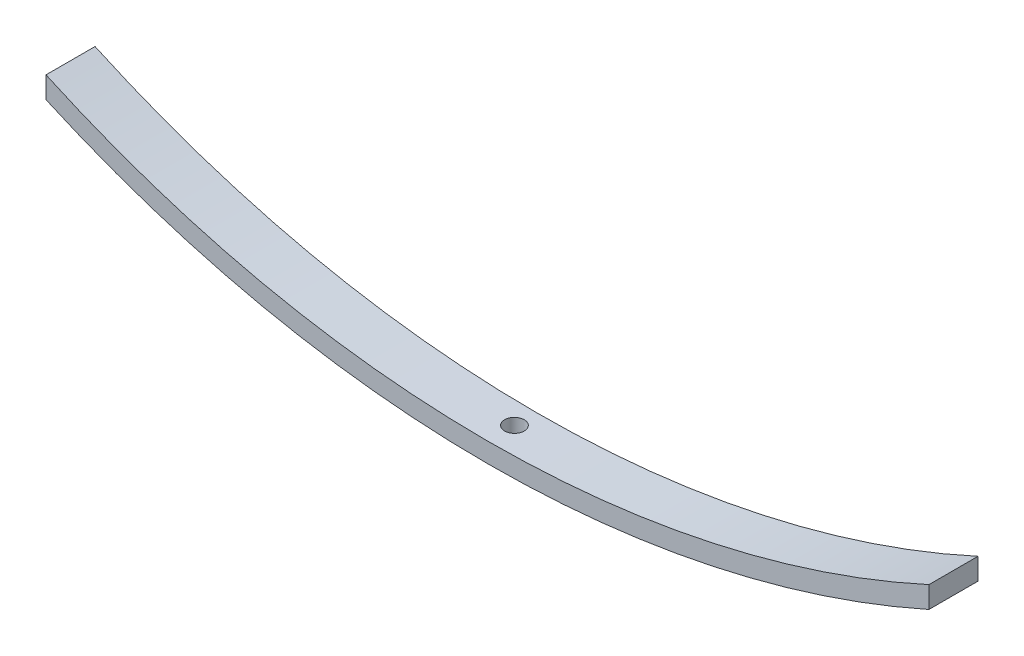
ISO-10303-21;
HEADER;
FILE_DESCRIPTION(('STEP AP214'),'2;1');
FILE_NAME('part.step','',(''),(''),'','','');
FILE_SCHEMA(('AUTOMOTIVE_DESIGN { 1 0 10303 214 1 1 1 1 }'));
ENDSEC;
DATA;
#1=APPLICATION_CONTEXT('core data for automotive mechanical design processes');
#2=APPLICATION_PROTOCOL_DEFINITION('international standard','automotive_design',2000,#1);
#3=PRODUCT_CONTEXT('',#1,'mechanical');
#4=PRODUCT('Part','Part','',(#3));
#5=PRODUCT_RELATED_PRODUCT_CATEGORY('part','',(#4));
#6=PRODUCT_DEFINITION_FORMATION('','',#4);
#7=PRODUCT_DEFINITION_CONTEXT('part definition',#1,'design');
#8=PRODUCT_DEFINITION('design','',#6,#7);
#9=PRODUCT_DEFINITION_SHAPE('','',#8);
#10=(LENGTH_UNIT() NAMED_UNIT(*) SI_UNIT(.MILLI.,.METRE.));
#11=(NAMED_UNIT(*) PLANE_ANGLE_UNIT() SI_UNIT($,.RADIAN.));
#12=(NAMED_UNIT(*) SI_UNIT($,.STERADIAN.) SOLID_ANGLE_UNIT());
#13=UNCERTAINTY_MEASURE_WITH_UNIT(LENGTH_MEASURE(1.E-05),#10,'distance_accuracy_value','');
#14=(GEOMETRIC_REPRESENTATION_CONTEXT(3) GLOBAL_UNCERTAINTY_ASSIGNED_CONTEXT((#13)) GLOBAL_UNIT_ASSIGNED_CONTEXT((#10,
#11,#12)) REPRESENTATION_CONTEXT('',''));
#15=CARTESIAN_POINT('',(0.,0.,0.));
#16=DIRECTION('',(0.,0.,1.));
#17=DIRECTION('',(1.,0.,0.));
#18=AXIS2_PLACEMENT_3D('',#15,#16,#17);
#19=CARTESIAN_POINT('',(-450.,-1003.74299499424,50.));
#20=DIRECTION('',(-1.,0.,0.));
#21=DIRECTION('',(0.,-1.,0.));
#22=AXIS2_PLACEMENT_3D('',#19,#20,#21);
#23=PLANE('',#22);
#24=DIRECTION('',(0.,1.,0.));
#25=VECTOR('',#24,1.);
#26=CARTESIAN_POINT('',(-450.,-1003.74299499424,0.));
#27=LINE('',#26,#25);
#28=CARTESIAN_POINT('',(-450.,-1003.74299499424,0.));
#29=VERTEX_POINT('',#28);
#30=CARTESIAN_POINT('',(-450.,-981.784090317214,0.));
#31=VERTEX_POINT('',#30);
#32=EDGE_CURVE('E117',#29,#31,#27,.T.);
#33=ORIENTED_EDGE('',*,*,#32,.F.);
#34=DIRECTION('',(0.,0.,-1.));
#35=VECTOR('',#34,1.);
#36=CARTESIAN_POINT('',(-450.,-1003.74299499424,50.));
#37=LINE('',#36,#35);
#38=CARTESIAN_POINT('',(-450.,-1003.74299499424,50.));
#39=VERTEX_POINT('',#38);
#40=EDGE_CURVE('E11',#39,#29,#37,.T.);
#41=ORIENTED_EDGE('',*,*,#40,.F.);
#42=DIRECTION('',(0.,1.,0.));
#43=VECTOR('',#42,1.);
#44=CARTESIAN_POINT('',(-450.,-1003.74299499424,50.));
#45=LINE('',#44,#43);
#46=CARTESIAN_POINT('',(-450.,-981.784090317214,50.));
#47=VERTEX_POINT('',#46);
#48=EDGE_CURVE('E109',#39,#47,#45,.T.);
#49=ORIENTED_EDGE('',*,*,#48,.T.);
#50=DIRECTION('',(0.,0.,-1.));
#51=VECTOR('',#50,1.);
#52=CARTESIAN_POINT('',(-450.,-981.784090317214,50.));
#53=LINE('',#52,#51);
#54=EDGE_CURVE('E85',#47,#31,#53,.T.);
#55=ORIENTED_EDGE('',*,*,#54,.T.);
#56=EDGE_LOOP('',(#33,#41,#49,#55));
#57=FACE_BOUND('',#56,.T.);
#58=ADVANCED_FACE('F39',(#57),#23,.T.);
#59=CARTESIAN_POINT('',(0.,0.,50.));
#60=DIRECTION('',(0.,0.,-1.));
#61=DIRECTION('',(-1.,0.,0.));
#62=AXIS2_PLACEMENT_3D('',#59,#60,#61);
#63=CYLINDRICAL_SURFACE('',#62,1100.);
#64=CARTESIAN_POINT('',(0.,-1100.,32.5));
#65=CARTESIAN_POINT('',(0.280947064307973,-1100.00000005117,32.5000020216511));
#66=CARTESIAN_POINT('',(0.561860972590403,-1099.99989213973,32.4881554478381));
#67=CARTESIAN_POINT('',(1.12178578051435,-1099.99946361781,32.4408518933722));
#68=CARTESIAN_POINT('',(1.40079616039585,-1099.99914295142,32.405388705864));
#69=CARTESIAN_POINT('',(1.95513034684573,-1099.99829744652,32.3110449823883));
#70=CARTESIAN_POINT('',(2.23044990980033,-1099.99777239089,32.2521395419737));
#71=CARTESIAN_POINT('',(2.7751497667588,-1099.99653304989,32.1113304951339));
#72=CARTESIAN_POINT('',(3.04452995547942,-1099.99581876118,32.0294264813815));
#73=CARTESIAN_POINT('',(3.57529527460837,-1099.99422165126,31.8432499038494));
#74=CARTESIAN_POINT('',(3.83668430405865,-1099.99333891383,31.738988454337));
#75=CARTESIAN_POINT('',(4.34975280879096,-1099.99142972603,31.5088127117588));
#76=CARTESIAN_POINT('',(4.60143213081407,-1099.9904032734,31.3828980770881));
#77=CARTESIAN_POINT('',(5.0932266343026,-1099.9882360755,31.1103460883793));
#78=CARTESIAN_POINT('',(5.33334464279631,-1099.9870953584,30.9637138351722));
#79=CARTESIAN_POINT('',(5.80037129075108,-1099.98473181792,30.6507488257479));
#80=CARTESIAN_POINT('',(6.02728021159513,-1099.9835089963,30.4844164894155));
#81=CARTESIAN_POINT('',(6.46631265262179,-1099.9810157489,30.1332061640088));
#82=CARTESIAN_POINT('',(6.67843408632362,-1099.97974531645,29.9483255667576));
#83=CARTESIAN_POINT('',(7.08634881654811,-1099.97719306931,29.5613522944773));
#84=CARTESIAN_POINT('',(7.2821420962676,-1099.97591125461,29.359259601736));
#85=CARTESIAN_POINT('',(7.65601579250191,-1099.97337257883,28.9392906534728));
#86=CARTESIAN_POINT('',(7.83409551840596,-1099.97211571873,28.7214137831341));
#87=CARTESIAN_POINT('',(8.17126738505734,-1099.96966268322,28.2714323481411));
#88=CARTESIAN_POINT('',(8.33035952943423,-1099.9684665078,28.0393277862065));
#89=CARTESIAN_POINT('',(8.6284250166648,-1099.96616879997,27.5625412338764));
#90=CARTESIAN_POINT('',(8.76739838401762,-1099.96506726744,27.3178592587974));
#91=CARTESIAN_POINT('',(9.02423845245466,-1099.96299011505,26.8176570746719));
#92=CARTESIAN_POINT('',(9.14210515282945,-1099.96201449518,26.5621368652612));
#93=CARTESIAN_POINT('',(9.35589356320991,-1099.96021686752,26.0420753556994));
#94=CARTESIAN_POINT('',(9.45181532069158,-1099.9593948594,25.7775340750661));
#95=CARTESIAN_POINT('',(9.6210320783027,-1099.95792778982,25.2413106724479));
#96=CARTESIAN_POINT('',(9.69432707912008,-1099.95728272837,24.9696285506802));
#97=CARTESIAN_POINT('',(9.81776748787596,-1099.95618788033,24.4210622387808));
#98=CARTESIAN_POINT('',(9.86791350030773,-1099.95573808865,24.1441781846845));
#99=CARTESIAN_POINT('',(9.94470215047097,-1099.95504652537,23.5871696647333));
#100=CARTESIAN_POINT('',(9.97134478860151,-1099.95480475378,23.3070451989335));
#101=CARTESIAN_POINT('',(10.0009371907584,-1099.95453609485,22.7455480448875));
#102=CARTESIAN_POINT('',(10.003887001745,-1099.95450920708,22.4641753591165));
#103=CARTESIAN_POINT('',(9.98607289476243,-1099.95467107818,21.9021817319619));
#104=CARTESIAN_POINT('',(9.965308977192,-1099.95485983704,21.6215607905655));
#105=CARTESIAN_POINT('',(9.90021603221038,-1099.95544763372,21.063073989674));
#106=CARTESIAN_POINT('',(9.85588769419265,-1099.95584666539,20.7852080498216));
#107=CARTESIAN_POINT('',(9.74398155305454,-1099.95684367609,20.2341983398215));
#108=CARTESIAN_POINT('',(9.67640375043628,-1099.95744165513,19.9610545695718));
#109=CARTESIAN_POINT('',(9.51847911119723,-1099.95881958582,19.421430683837));
#110=CARTESIAN_POINT('',(9.42813224886001,-1099.95959953768,19.1549505758786));
#111=CARTESIAN_POINT('',(9.22531191308742,-1099.96131927302,18.6305486862249));
#112=CARTESIAN_POINT('',(9.11283843914294,-1099.9622590565,18.3726269047267));
#113=CARTESIAN_POINT('',(8.86656272873204,-1099.96427179258,17.8671714055499));
#114=CARTESIAN_POINT('',(8.73276017902452,-1099.96534474714,17.6196378405013));
#115=CARTESIAN_POINT('',(8.44477876718316,-1099.96759335706,17.1367223888157));
#116=CARTESIAN_POINT('',(8.29059990492967,-1099.96876901242,16.9013405022501));
#117=CARTESIAN_POINT('',(7.96296196272636,-1099.97118965167,16.4444016228667));
#118=CARTESIAN_POINT('',(7.78950288654837,-1099.97243463555,16.2228446273443));
#119=CARTESIAN_POINT('',(7.42453755271911,-1099.97495859309,15.7951303567988));
#120=CARTESIAN_POINT('',(7.23303129461007,-1099.97623756676,15.5889730821661));
#121=CARTESIAN_POINT('',(6.83332562771209,-1099.97879324704,15.1935164840785));
#122=CARTESIAN_POINT('',(6.62512561226872,-1099.98006995357,15.0042177737951));
#123=CARTESIAN_POINT('',(6.19351853340997,-1099.98258481179,14.6438324390783));
#124=CARTESIAN_POINT('',(5.97011146959816,-1099.98382296348,14.4727458151196));
#125=CARTESIAN_POINT('',(5.50967840926728,-1099.98622556548,14.1500009250355));
#126=CARTESIAN_POINT('',(5.27265241071586,-1099.98739001578,13.9983426618094));
#127=CARTESIAN_POINT('',(4.7866664993514,-1099.98961216017,13.7155327561576));
#128=CARTESIAN_POINT('',(4.5377065866729,-1099.99066985426,13.5843811135007));
#129=CARTESIAN_POINT('',(4.02962249751724,-1099.99264846258,13.3435168404398));
#130=CARTESIAN_POINT('',(3.77049831242723,-1099.99356937668,13.2338042282029));
#131=CARTESIAN_POINT('',(3.24392807012183,-1099.99524828184,13.0365982714823));
#132=CARTESIAN_POINT('',(2.9764820128677,-1099.99600627289,12.9491049271019));
#133=CARTESIAN_POINT('',(2.43516952517331,-1099.99733781424,12.7969596925449));
#134=CARTESIAN_POINT('',(2.16130309631317,-1099.9979113646,12.7323077967468));
#135=CARTESIAN_POINT('',(1.60909695182085,-1099.99885774291,12.6263051983335));
#136=CARTESIAN_POINT('',(1.33075723632501,-1099.99923057088,12.5849544950081));
#137=CARTESIAN_POINT('',(0.771593545451839,-1099.99976491098,12.5258494128803));
#138=CARTESIAN_POINT('',(0.490769659433458,-1099.99992643068,12.5080941887633));
#139=CARTESIAN_POINT('',(-0.0713756577629724,-1100.00003359402,12.4963035779614));
#140=CARTESIAN_POINT('',(-0.352697088929224,-1099.99997923768,12.5022681907142));
#141=CARTESIAN_POINT('',(-0.913837378686011,-1099.99965619194,12.5378748347896));
#142=CARTESIAN_POINT('',(-1.19365623736931,-1099.99938750255,12.5675168646504));
#143=CARTESIAN_POINT('',(-1.74980200235998,-1099.99864341784,12.6502675468223));
#144=CARTESIAN_POINT('',(-2.02612890867426,-1099.99816802251,12.7033761990869));
#145=CARTESIAN_POINT('',(-2.57332170066523,-1099.99702402999,12.832681392134));
#146=CARTESIAN_POINT('',(-2.84418767679329,-1099.996355436,12.9088775501743));
#147=CARTESIAN_POINT('',(-3.37853774997116,-1099.994844021,13.083816268699));
#148=CARTESIAN_POINT('',(-3.64202184713313,-1099.99400119998,13.1825588288409));
#149=CARTESIAN_POINT('',(-4.15973514308947,-1099.99216525379,13.4018882914459));
#150=CARTESIAN_POINT('',(-4.4139643416674,-1099.99117212861,13.52247519442));
#151=CARTESIAN_POINT('',(-4.91136066858346,-1099.98906376295,13.7846360235526));
#152=CARTESIAN_POINT('',(-5.15452779659761,-1099.98794852246,13.9262099503258));
#153=CARTESIAN_POINT('',(-5.62807822212533,-1099.98562754781,14.2293426724206));
#154=CARTESIAN_POINT('',(-5.85846115650697,-1099.98442181108,14.3909020350031));
#155=CARTESIAN_POINT('',(-6.3047980722711,-1099.98195409673,14.7328539213465));
#156=CARTESIAN_POINT('',(-6.52075205340541,-1099.98069211911,14.9132464454312));
#157=CARTESIAN_POINT('',(-6.93669609007042,-1099.97814774351,15.2915824009235));
#158=CARTESIAN_POINT('',(-7.1366861363515,-1099.97686534553,15.4895258425001));
#159=CARTESIAN_POINT('',(-7.5192805340355,-1099.97431653123,15.9015564578257));
#160=CARTESIAN_POINT('',(-7.70188488516435,-1099.97305011491,16.1156436318292));
#161=CARTESIAN_POINT('',(-8.04841491977836,-1099.97056917538,16.5584464198348));
#162=CARTESIAN_POINT('',(-8.21234005256345,-1099.96935465371,16.7871624648145));
#163=CARTESIAN_POINT('',(-8.52034002029632,-1099.96701202092,17.2575914138369));
#164=CARTESIAN_POINT('',(-8.66441485480448,-1099.96588390981,17.4993043181674));
#165=CARTESIAN_POINT('',(-8.93168971938829,-1099.96374612479,17.9940083611056));
#166=CARTESIAN_POINT('',(-9.0548897731304,-1099.96273645075,18.2469994869264));
#167=CARTESIAN_POINT('',(-9.27953928096262,-1099.96086420252,18.7624616538708));
#168=CARTESIAN_POINT('',(-9.38098873558057,-1099.96000162833,19.0249326947644));
#169=CARTESIAN_POINT('',(-9.56141420827453,-1099.95844808083,19.5574843714006));
#170=CARTESIAN_POINT('',(-9.6403905882246,-1099.95775710476,19.8275648845344));
#171=CARTESIAN_POINT('',(-9.77531048728018,-1099.95656635235,20.3734194094439));
#172=CARTESIAN_POINT('',(-9.8312540065221,-1099.95606657601,20.6491934211859));
#173=CARTESIAN_POINT('',(-9.91971041816975,-1099.95527241126,21.2044746995368));
#174=CARTESIAN_POINT('',(-9.95222327318557,-1099.95497802318,21.4839819721024));
#175=CARTESIAN_POINT('',(-9.9935869887929,-1099.95460299441,22.044742053393));
#176=CARTESIAN_POINT('',(-10.0024378499717,-1099.95452235372,22.3259948620747));
#177=CARTESIAN_POINT('',(-9.99641474966445,-1099.95457710805,22.8882356169393));
#178=CARTESIAN_POINT('',(-9.98154168886788,-1099.95471249489,23.1692235727723));
#179=CARTESIAN_POINT('',(-9.92817819983436,-1099.95519544543,23.7289476401099));
#180=CARTESIAN_POINT('',(-9.8896877721794,-1099.95554300913,24.00768375167));
#181=CARTESIAN_POINT('',(-9.78936315775909,-1099.95644044724,24.5609230488737));
#182=CARTESIAN_POINT('',(-9.72752892421368,-1099.95699032205,24.8354262260335));
#183=CARTESIAN_POINT('',(-9.58095639853485,-1099.95827677224,25.378247578608));
#184=CARTESIAN_POINT('',(-9.49621810655042,-1099.95901334763,25.6465657540628));
#185=CARTESIAN_POINT('',(-9.304438217086,-1099.96065230423,26.1751145228585));
#186=CARTESIAN_POINT('',(-9.19739620805113,-1099.96155468852,26.4353449668601));
#187=CARTESIAN_POINT('',(-8.96177089994736,-1099.96349963719,26.9458631765871));
#188=CARTESIAN_POINT('',(-8.8331875967543,-1099.9645422016,27.1961509404087));
#189=CARTESIAN_POINT('',(-8.55539929002957,-1099.96673787208,27.684995049854));
#190=CARTESIAN_POINT('',(-8.40619508437191,-1099.96789097387,27.9235518488939));
#191=CARTESIAN_POINT('',(-8.08822199569385,-1099.97027502198,28.3872485290119));
#192=CARTESIAN_POINT('',(-7.91945313189211,-1099.97150596823,28.6123884232693));
#193=CARTESIAN_POINT('',(-7.56356432748525,-1099.97401066856,29.0476341025049));
#194=CARTESIAN_POINT('',(-7.37644583567259,-1099.97528441926,29.2577410721438));
#195=CARTESIAN_POINT('',(-6.98517229922889,-1099.97783870054,29.6614515965173));
#196=CARTESIAN_POINT('',(-6.78101689079579,-1099.97911923127,29.855054798656));
#197=CARTESIAN_POINT('',(-6.35707164122872,-1099.98165101663,30.2244223053224));
#198=CARTESIAN_POINT('',(-6.13727796443782,-1099.98290226398,30.400182207524));
#199=CARTESIAN_POINT('',(-5.68366731250256,-1099.9853396097,30.7325563312236));
#200=CARTESIAN_POINT('',(-5.44985055868444,-1099.98652570909,30.8891708547745));
#201=CARTESIAN_POINT('',(-4.96972995606513,-1099.98879968479,31.1822187171478));
#202=CARTESIAN_POINT('',(-4.7234197905025,-1099.98988751061,31.3186417076206));
#203=CARTESIAN_POINT('',(-4.22018163412486,-1099.99193332191,31.5702373393554));
#204=CARTESIAN_POINT('',(-3.96325383145126,-1099.99289130968,31.6854103569634));
#205=CARTESIAN_POINT('',(-3.44087746622745,-1099.99464930056,31.8935788467592));
#206=CARTESIAN_POINT('',(-3.17543826339022,-1099.99544947072,31.9865977921384));
#207=CARTESIAN_POINT('',(-2.63775802567634,-1099.99687023153,32.1499313837608));
#208=CARTESIAN_POINT('',(-2.36551879736234,-1099.99749086934,32.2202519925835));
#209=CARTESIAN_POINT('',(-1.7475100578521,-1099.99866540734,32.3523789407716));
#210=CARTESIAN_POINT('',(-1.40033267948958,-1099.99916407617,32.4076898095124));
#211=CARTESIAN_POINT('',(-0.702086281630147,-1099.99983134053,32.4814990757067));
#212=CARTESIAN_POINT('',(-0.351017262236259,-1099.99999993607,32.4999974741347));
#213=CARTESIAN_POINT('',(0.,-1100.,32.5));
#214=B_SPLINE_CURVE_WITH_KNOTS('',3,(#64,#65,#66,#67,#68,#69,#70,#71,#72,#73,#74,#75,#76,#77,
#78,#79,#80,#81,#82,#83,#84,#85,#86,#87,#88,#89,#90,#91,#92,#93,#94,#95,#96,#97,#98,#99,#100,
#101,#102,#103,#104,#105,#106,#107,#108,#109,#110,#111,#112,#113,#114,#115,#116,#117,#118,#119,
#120,#121,#122,#123,#124,#125,#126,#127,#128,#129,#130,#131,#132,#133,#134,#135,#136,#137,#138,
#139,#140,#141,#142,#143,#144,#145,#146,#147,#148,#149,#150,#151,#152,#153,#154,#155,#156,#157,
#158,#159,#160,#161,#162,#163,#164,#165,#166,#167,#168,#169,#170,#171,#172,#173,#174,#175,#176,
#177,#178,#179,#180,#181,#182,#183,#184,#185,#186,#187,#188,#189,#190,#191,#192,#193,#194,#195,
#196,#197,#198,#199,#200,#201,#202,#203,#204,#205,#206,#207,#208,#209,#210,#211,#212,#213),
.UNSPECIFIED.,.T.,.F.,(4,2,2,2,2,2,2,2,2,2,2,2,2,2,2,2,2,2,2,2,2,2,2,2,2,2,2,2,2,2,2,2,2,2,2,2,
2,2,2,2,2,2,2,2,2,2,2,2,2,2,2,2,2,2,2,2,2,2,2,2,2,2,2,2,2,2,2,2,2,2,2,2,2,2,4),(0.,
0.842534577510601,1.68529067514222,2.5289444955584,3.37261325884719,4.21586358809915,
5.0591272218507,5.90218359847124,6.74522200953625,7.58837913164906,8.43153712143766,
9.27472797114516,10.1179186596733,10.9611083214188,11.8042980115051,12.6474858774049,
13.4906737176693,14.3338395383882,15.1770053447907,16.020169479999,16.8633336010304,
17.7064730560677,18.5496124928953,19.3927528820083,20.2358932905217,21.079046082627,
21.9221988796832,22.7653515117916,23.6085041652863,24.4516874730138,25.2948708027221,
26.1380542582581,26.9812377042883,27.8244218648185,28.667606029274,29.5107899862167,
30.3539739174617,31.1971276405931,32.0402813437306,32.8834349948124,33.7265886442239,
34.5697283166834,35.4128679763346,36.2560076557052,37.0991473597693,37.9423110007654,
38.7854746562632,39.6286388002934,40.4718029576155,41.314991966646,42.15818099435,
43.001369066095,43.8445571173779,44.6877315904048,45.5309060584382,46.3740818719793,
47.2172576645916,48.0604014464112,48.9035452074536,49.7466906581313,50.5898361033245,
51.4329971078685,52.2761582738391,53.1192868249362,53.9624145478228,54.8054757551859,
55.6485549696765,56.491841687007,57.3351150982441,58.1788192094785,59.0225083769307,
59.865299602535,60.7078692565258,61.7605379836224,62.813206682851),.UNSPECIFIED.);
#215=CARTESIAN_POINT('',(0.,-1100.,32.5));
#216=VERTEX_POINT('',#215);
#217=EDGE_CURVE('E122',#216,#216,#214,.T.);
#218=ORIENTED_EDGE('',*,*,#217,.T.);
#219=EDGE_LOOP('',(#218));
#220=FACE_BOUND('',#219,.T.);
#221=CARTESIAN_POINT('',(0.,0.,0.));
#222=DIRECTION('',(0.,0.,1.));
#223=DIRECTION('',(1.,0.,0.));
#224=AXIS2_PLACEMENT_3D('',#221,#222,#223);
#225=CIRCLE('',#224,1100.);
#226=CARTESIAN_POINT('',(450.,-1003.74299499424,0.));
#227=VERTEX_POINT('',#226);
#228=EDGE_CURVE('E77',#29,#227,#225,.T.);
#229=ORIENTED_EDGE('',*,*,#228,.T.);
#230=DIRECTION('',(0.,0.,-1.));
#231=VECTOR('',#230,1.);
#232=CARTESIAN_POINT('',(450.,-1003.74299499424,50.));
#233=LINE('',#232,#231);
#234=CARTESIAN_POINT('',(450.,-1003.74299499424,50.));
#235=VERTEX_POINT('',#234);
#236=EDGE_CURVE('E53',#235,#227,#233,.T.);
#237=ORIENTED_EDGE('',*,*,#236,.F.);
#238=CARTESIAN_POINT('',(0.,0.,50.));
#239=DIRECTION('',(0.,0.,1.));
#240=DIRECTION('',(1.,0.,0.));
#241=AXIS2_PLACEMENT_3D('',#238,#239,#240);
#242=CIRCLE('',#241,1100.);
#243=EDGE_CURVE('E95',#39,#235,#242,.T.);
#244=ORIENTED_EDGE('',*,*,#243,.F.);
#245=ORIENTED_EDGE('',*,*,#40,.T.);
#246=EDGE_LOOP('',(#229,#237,#244,#245));
#247=FACE_BOUND('',#246,.T.);
#248=ADVANCED_FACE('F144',(#220,#247),#63,.T.);
#249=CARTESIAN_POINT('',(450.,-1003.74299499424,50.));
#250=DIRECTION('',(-1.,0.,0.));
#251=DIRECTION('',(0.,0.,1.));
#252=AXIS2_PLACEMENT_3D('',#249,#250,#251);
#253=PLANE('',#252);
#254=DIRECTION('',(0.,1.,0.));
#255=VECTOR('',#254,1.);
#256=CARTESIAN_POINT('',(450.,-1003.74299499424,0.));
#257=LINE('',#256,#255);
#258=CARTESIAN_POINT('',(450.,-981.784090317214,0.));
#259=VERTEX_POINT('',#258);
#260=EDGE_CURVE('E103',#227,#259,#257,.T.);
#261=ORIENTED_EDGE('',*,*,#260,.T.);
#262=DIRECTION('',(0.,0.,-1.));
#263=VECTOR('',#262,1.);
#264=CARTESIAN_POINT('',(450.,-981.784090317214,50.));
#265=LINE('',#264,#263);
#266=CARTESIAN_POINT('',(450.,-981.784090317214,50.));
#267=VERTEX_POINT('',#266);
#268=EDGE_CURVE('E100',#267,#259,#265,.T.);
#269=ORIENTED_EDGE('',*,*,#268,.F.);
#270=DIRECTION('',(0.,1.,0.));
#271=VECTOR('',#270,1.);
#272=CARTESIAN_POINT('',(450.,-1003.74299499424,50.));
#273=LINE('',#272,#271);
#274=EDGE_CURVE('E90',#235,#267,#273,.T.);
#275=ORIENTED_EDGE('',*,*,#274,.F.);
#276=ORIENTED_EDGE('',*,*,#236,.T.);
#277=EDGE_LOOP('',(#261,#269,#275,#276));
#278=FACE_BOUND('',#277,.T.);
#279=ADVANCED_FACE('F101',(#278),#253,.F.);
#280=CARTESIAN_POINT('',(0.,0.,50.));
#281=DIRECTION('',(0.,0.,-1.));
#282=DIRECTION('',(-1.,0.,0.));
#283=AXIS2_PLACEMENT_3D('',#280,#281,#282);
#284=CYLINDRICAL_SURFACE('',#283,1080.);
#285=CARTESIAN_POINT('',(0.,-1080.,32.5));
#286=CARTESIAN_POINT('',(0.280946830993139,-1080.00000005212,32.5000020218661));
#287=CARTESIAN_POINT('',(0.561860503197048,-1079.9998901425,32.4881554676291));
#288=CARTESIAN_POINT('',(1.12178483729184,-1079.99945368572,32.440851992922));
#289=CARTESIAN_POINT('',(1.40079497943695,-1079.99912708161,32.4053888657761));
#290=CARTESIAN_POINT('',(1.95512868065271,-1079.99826592066,32.3110453070886));
#291=CARTESIAN_POINT('',(2.23044799622377,-1079.99773114268,32.2521399718246));
#292=CARTESIAN_POINT('',(2.77514735994904,-1079.99646885303,32.1113311821343));
#293=CARTESIAN_POINT('',(3.04452730281656,-1079.99574133795,32.0294273203683));
#294=CARTESIAN_POINT('',(3.57529212522385,-1079.9941146546,31.8432511000017));
#295=CARTESIAN_POINT('',(3.8366809041254,-1079.99321557165,31.7389898565638));
#296=CARTESIAN_POINT('',(4.34974892135516,-1079.9912710316,31.5088145788331));
#297=CARTESIAN_POINT('',(4.60142800642967,-1079.99022557219,31.3829002029474));
#298=CARTESIAN_POINT('',(5.09322206270993,-1079.98801824419,31.1103487817793));
#299=CARTESIAN_POINT('',(5.33333986077639,-1079.98685640427,30.9637168370231));
#300=CARTESIAN_POINT('',(5.80036612162051,-1079.98444909752,30.650752492377));
#301=CARTESIAN_POINT('',(6.02727486576485,-1079.98320363246,30.4844205123477));
#302=CARTESIAN_POINT('',(6.46630720988523,-1079.98066421508,30.1332107715757));
#303=CARTESIAN_POINT('',(6.67842870908606,-1079.97937025591,29.9483303847854));
#304=CARTESIAN_POINT('',(7.08634359206412,-1079.97677074406,29.5613575338946));
#305=CARTESIAN_POINT('',(7.28213695902863,-1079.97546519138,29.3592650520716));
#306=CARTESIAN_POINT('',(7.6560108561917,-1079.97287950121,28.9392965186679));
#307=CARTESIAN_POINT('',(7.83409069574824,-1079.97159936472,28.7214198522413));
#308=CARTESIAN_POINT('',(8.1712628178961,-1079.96910089973,28.2714388104494));
#309=CARTESIAN_POINT('',(8.33035510411368,-1079.96788257121,28.0393344378013));
#310=CARTESIAN_POINT('',(8.62842099958237,-1079.96554230861,27.5625480867652));
#311=CARTESIAN_POINT('',(8.76739462028087,-1079.96442037447,27.3178661155338));
#312=CARTESIAN_POINT('',(9.02423519233012,-1079.96230475039,26.8176638970605));
#313=CARTESIAN_POINT('',(9.14210214295948,-1079.96131106045,26.5621436494481));
#314=CARTESIAN_POINT('',(9.35589104374611,-1079.95948013732,26.0420820221502));
#315=CARTESIAN_POINT('',(9.45181304149456,-1079.95864290379,25.7775406620299));
#316=CARTESIAN_POINT('',(9.62103026305726,-1079.95714866038,25.241317060164));
#317=CARTESIAN_POINT('',(9.69432548758416,-1079.95649165051,24.9696348186434));
#318=CARTESIAN_POINT('',(9.81776625564527,-1079.95537652278,24.4210685195311));
#319=CARTESIAN_POINT('',(9.86791242792046,-1079.95491839952,24.1441846034323));
#320=CARTESIAN_POINT('',(9.94470141817235,-1079.9542140254,23.5871763367607));
#321=CARTESIAN_POINT('',(9.9713442365628,-1079.95396777453,23.307051986245));
#322=CARTESIAN_POINT('',(10.0009370161434,-1079.95369413652,22.7455550452727));
#323=CARTESIAN_POINT('',(10.0038870244512,-1079.95366674896,22.4641824572998));
#324=CARTESIAN_POINT('',(9.9860733277684,-1079.95383161413,21.9021890106005));
#325=CARTESIAN_POINT('',(9.96530962319048,-1079.95402386687,21.6215681518612));
#326=CARTESIAN_POINT('',(9.90021715618329,-1079.95462254524,21.0630818145463));
#327=CARTESIAN_POINT('',(9.85588910924836,-1079.95502896438,20.7852162525714));
#328=CARTESIAN_POINT('',(9.74398361899045,-1079.95604443403,20.2342072770111));
#329=CARTESIAN_POINT('',(9.67640617618953,-1079.95665348453,19.9610638633197));
#330=CARTESIAN_POINT('',(9.5184823256382,-1079.95805692786,19.421440662503));
#331=CARTESIAN_POINT('',(9.42813589210945,-1079.95885132089,19.1549608829225));
#332=CARTESIAN_POINT('',(9.22531648275569,-1079.9606028983,18.6305596141169));
#333=CARTESIAN_POINT('',(9.11284350640294,-1079.96156008268,18.3726381250958));
#334=CARTESIAN_POINT('',(8.86656878874518,-1079.96361008723,17.8671830227862));
#335=CARTESIAN_POINT('',(8.73276672223304,-1079.96470290946,17.6196495679578));
#336=CARTESIAN_POINT('',(8.44478631650534,-1079.96699315679,17.1367342931325));
#337=CARTESIAN_POINT('',(8.2906079771651,-1079.96819058189,16.9013524732098));
#338=CARTESIAN_POINT('',(7.9629711133764,-1079.97065604481,16.4444136717694));
#339=CARTESIAN_POINT('',(7.78951259254884,-1079.97192408261,16.2228566876553));
#340=CARTESIAN_POINT('',(7.42454839422626,-1079.97449477788,15.7951423767921));
#341=CARTESIAN_POINT('',(7.2330427162563,-1079.97579743535,15.5889850504484));
#342=CARTESIAN_POINT('',(6.83333795236948,-1079.9784004436,15.1935280096799));
#343=CARTESIAN_POINT('',(6.62513823720578,-1079.97970079429,15.0042289312597));
#344=CARTESIAN_POINT('',(6.19353172013911,-1079.98226222741,14.6438428339984));
#345=CARTESIAN_POINT('',(5.97012491782503,-1079.98352330983,14.4727558156496));
#346=CARTESIAN_POINT('',(5.50969233445025,-1079.98597040901,14.150010112189));
#347=CARTESIAN_POINT('',(5.27266655134777,-1079.98715642574,13.9983514299899));
#348=CARTESIAN_POINT('',(4.78668101877967,-1079.98941972652,13.7155406661651));
#349=CARTESIAN_POINT('',(4.53772126945362,-1079.99049701057,13.5843885842996));
#350=CARTESIAN_POINT('',(4.02963744185973,-1079.99251226629,13.3435234148167));
#351=CARTESIAN_POINT('',(3.77051335463881,-1079.99345023783,13.233810346084));
#352=CARTESIAN_POINT('',(3.24394324915048,-1079.99516024107,13.0366034717934));
#353=CARTESIAN_POINT('',(2.97649723084286,-1079.99593227276,12.9491096663429));
#354=CARTESIAN_POINT('',(2.43518476578343,-1079.99728848002,12.796963514242));
#355=CARTESIAN_POINT('',(2.16131832065999,-1079.99787265563,12.7323111617987));
#356=CARTESIAN_POINT('',(1.60911209118594,-1079.99883656744,12.6263076619849));
#357=CARTESIAN_POINT('',(1.33077230697676,-1079.99921630364,12.5849565138779));
#358=CARTESIAN_POINT('',(0.771608807900758,-1079.9997605465,12.5258506003383));
#359=CARTESIAN_POINT('',(0.490785185734503,-1079.99992506116,12.5080949579956));
#360=CARTESIAN_POINT('',(-0.0713596417628769,-1080.00003421713,12.4963034703321));
#361=CARTESIAN_POINT('',(-0.35268084708176,-1079.99997885844,12.5022676244279));
#362=CARTESIAN_POINT('',(-0.91382072087917,-1079.99964983916,12.5378733134857));
#363=CARTESIAN_POINT('',(-1.19363938945646,-1079.99937617858,12.5675148468914));
#364=CARTESIAN_POINT('',(-1.74978481047988,-1079.99861832373,12.6502644997231));
#365=CARTESIAN_POINT('',(-2.0261115629332,-1079.99813412945,12.7033726191009));
#366=CARTESIAN_POINT('',(-2.57330391399844,-1079.99696896159,12.8326766701471));
#367=CARTESIAN_POINT('',(-2.84416960645182,-1079.99628799138,12.9088722047261));
#368=CARTESIAN_POINT('',(-3.37851916238579,-1079.99474859754,13.0838096128953));
#369=CARTESIAN_POINT('',(-3.64200302598271,-1079.9938901739,13.1825514861301));
#370=CARTESIAN_POINT('',(-4.15971591512815,-1079.99202023886,13.4018795146803));
#371=CARTESIAN_POINT('',(-4.4139449404069,-1079.99100872744,13.5224656706323));
#372=CARTESIAN_POINT('',(-4.91134099008323,-1079.98886132745,13.7846249497716));
#373=CARTESIAN_POINT('',(-5.15450801414461,-1079.98772543887,13.9261980735967));
#374=CARTESIAN_POINT('',(-5.62805856512507,-1079.98536149022,14.2293293029079));
#375=CARTESIAN_POINT('',(-5.85844171527824,-1079.98413342744,14.3908879969553));
#376=CARTESIAN_POINT('',(-6.30477912256011,-1079.9816200184,14.7328385470357));
#377=CARTESIAN_POINT('',(-6.52073337943143,-1079.98033467214,14.9132304034045));
#378=CARTESIAN_POINT('',(-6.93667803477774,-1079.97774317989,15.2915650346871));
#379=CARTESIAN_POINT('',(-7.13666842389908,-1079.97643703389,15.4895078198843));
#380=CARTESIAN_POINT('',(-7.51926357718869,-1079.97384101818,15.9015371438356));
#381=CARTESIAN_POINT('',(-7.70186834107311,-1079.97255114848,16.1156236828533));
#382=CARTESIAN_POINT('',(-8.04839946183083,-1079.97002426045,16.5584254760602));
#383=CARTESIAN_POINT('',(-8.21232524764429,-1079.96878724374,16.7871411771634));
#384=CARTESIAN_POINT('',(-8.52032654745661,-1079.96640122,17.2575695110974));
#385=CARTESIAN_POINT('',(-8.66440206099904,-1079.96525221297,17.4992821442271));
#386=CARTESIAN_POINT('',(-8.93167830191261,-1079.96307482852,17.9939857220713));
#387=CARTESIAN_POINT('',(-9.05487905301033,-1079.96204645097,18.2469766539662));
#388=CARTESIAN_POINT('',(-9.27952996501027,-1079.96013951916,18.7624385138751));
#389=CARTESIAN_POINT('',(-9.38098012645896,-1079.9592609649,19.0249094416509));
#390=CARTESIAN_POINT('',(-9.56140695898478,-1079.95767863521,19.5574608163621));
#391=CARTESIAN_POINT('',(-9.64038400514027,-1079.95697485685,19.8275411362134));
#392=CARTESIAN_POINT('',(-9.7753052527145,-1079.95576204032,20.3733953465551));
#393=CARTESIAN_POINT('',(-9.83124945427578,-1079.95525300215,20.6491692370102));
#394=CARTESIAN_POINT('',(-9.91970723727702,-1079.95444411721,21.2044503396452));
#395=CARTESIAN_POINT('',(-9.95222078150988,-1079.95414427077,21.4839575577527));
#396=CARTESIAN_POINT('',(-9.99358587528078,-1079.95376228377,22.0447175937094));
#397=CARTESIAN_POINT('',(-10.0024374254284,-1079.95368014322,22.3259704115137));
#398=CARTESIAN_POINT('',(-9.99641570123941,-1079.95373589887,22.8882108623938));
#399=CARTESIAN_POINT('',(-9.98154335956891,-1079.95387378643,23.16919850546));
#400=CARTESIAN_POINT('',(-9.92818136288653,-1079.95436566761,23.7289220060057));
#401=CARTESIAN_POINT('',(-9.8896917084794,-1079.95471966123,24.0076578635429));
#402=CARTESIAN_POINT('',(-9.78936869165727,-1079.95563370582,24.5608967132813));
#403=CARTESIAN_POINT('',(-9.72753528247904,-1079.95619375719,24.835399697002));
#404=CARTESIAN_POINT('',(-9.58096445399798,-1079.95750401824,25.378220727086));
#405=CARTESIAN_POINT('',(-9.49622703483393,-1079.9582542279,25.6465387734868));
#406=CARTESIAN_POINT('',(-9.30444893694187,-1079.95992352398,26.1750873526153));
#407=CARTESIAN_POINT('',(-9.19740784676534,-1079.96084261352,26.4353177360436));
#408=CARTESIAN_POINT('',(-8.96178441771633,-1079.96282356923,26.9458359018268));
#409=CARTESIAN_POINT('',(-8.83320207472319,-1079.96388543542,27.1961236822799));
#410=CARTESIAN_POINT('',(-8.55541572186873,-1079.96612175732,27.6849679134986));
#411=CARTESIAN_POINT('',(-8.40621250969461,-1079.96729620867,27.9235248175718));
#412=CARTESIAN_POINT('',(-8.08824143301179,-1079.96972439844,28.3872218037586));
#413=CARTESIAN_POINT('',(-7.91947358769898,-1079.97097813678,28.6123618990358));
#414=CARTESIAN_POINT('',(-7.56358659276229,-1079.97352921692,29.0476083793136));
#415=CARTESIAN_POINT('',(-7.37646886715792,-1079.97482655533,29.2577159287109));
#416=CARTESIAN_POINT('',(-6.98519681697802,-1079.97742813892,29.6614276791821));
#417=CARTESIAN_POINT('',(-6.78104212858852,-1079.97873238425,29.855031527651));
#418=CARTESIAN_POINT('',(-6.35709826309957,-1079.98131105801,30.224400393115));
#419=CARTESIAN_POINT('',(-6.13730525038273,-1079.98258547901,30.4001610078621));
#420=CARTESIAN_POINT('',(-5.68369585853967,-1079.98506796693,30.7325366209558));
#421=CARTESIAN_POINT('',(-5.44987970073429,-1079.98627603489,30.8891519213455));
#422=CARTESIAN_POINT('',(-4.96976007141037,-1079.98859213072,31.182201482485));
#423=CARTESIAN_POINT('',(-4.72345027585649,-1079.98970010713,31.3186253830647));
#424=CARTESIAN_POINT('',(-4.22021276110309,-1079.99178381616,31.5702228604991));
#425=CARTESIAN_POINT('',(-3.96328523005301,-1079.99275955113,31.6853968137117));
#426=CARTESIAN_POINT('',(-3.44090930056789,-1079.99455011157,31.8935671901833));
#427=CARTESIAN_POINT('',(-3.17547026177008,-1079.9953651072,31.9865870861568));
#428=CARTESIAN_POINT('',(-2.63779025128926,-1079.99681219396,32.1499225799908));
#429=CARTESIAN_POINT('',(-2.36555108615882,-1079.99744433313,32.2202441403109));
#430=CARTESIAN_POINT('',(-1.74753723591332,-1079.99864065029,32.3523743153585));
#431=CARTESIAN_POINT('',(-1.40035453775591,-1079.9991485695,32.4076869153147));
#432=CARTESIAN_POINT('',(-0.702097305266922,-1079.99982821179,32.4814984940421));
#433=CARTESIAN_POINT('',(-0.351022771042235,-1079.99999993487,32.4999974738243));
#434=CARTESIAN_POINT('',(0.,-1080.,32.5));
#435=B_SPLINE_CURVE_WITH_KNOTS('',3,(#285,#286,#287,#288,#289,#290,#291,#292,#293,#294,#295,
#296,#297,#298,#299,#300,#301,#302,#303,#304,#305,#306,#307,#308,#309,#310,#311,#312,#313,#314,
#315,#316,#317,#318,#319,#320,#321,#322,#323,#324,#325,#326,#327,#328,#329,#330,#331,#332,#333,
#334,#335,#336,#337,#338,#339,#340,#341,#342,#343,#344,#345,#346,#347,#348,#349,#350,#351,#352,
#353,#354,#355,#356,#357,#358,#359,#360,#361,#362,#363,#364,#365,#366,#367,#368,#369,#370,#371,
#372,#373,#374,#375,#376,#377,#378,#379,#380,#381,#382,#383,#384,#385,#386,#387,#388,#389,#390,
#391,#392,#393,#394,#395,#396,#397,#398,#399,#400,#401,#402,#403,#404,#405,#406,#407,#408,#409,
#410,#411,#412,#413,#414,#415,#416,#417,#418,#419,#420,#421,#422,#423,#424,#425,#426,#427,#428,
#429,#430,#431,#432,#433,#434),.UNSPECIFIED.,.T.,.F.,(4,2,2,2,2,2,2,2,2,2,2,2,2,2,2,2,2,2,2,2,2,
2,2,2,2,2,2,2,2,2,2,2,2,2,2,2,2,2,2,2,2,2,2,2,2,2,2,2,2,2,2,2,2,2,2,2,2,2,2,2,2,2,2,2,2,2,2,2,2,
2,2,2,2,2,4),(0.,0.842533872651942,1.68528925921438,2.52894234333142,3.37261037079926,
4.21585992995773,5.05912279316949,5.90217841130945,6.74521606490536,7.58837324303029,
8.43153128932497,9.27472219707642,10.1179129437945,10.9611032107406,11.8042935065059,
12.6474819736593,13.4906704142552,14.3338359520421,15.1770014749864,16.0201653211388,
16.8633291526226,17.70646738422,18.5496055968852,19.3927447641297,20.2358839514834,
21.0790359955084,21.9221880446924,22.7653399355293,23.6084918485557,24.4516755573844,
25.2948592890078,26.1380431470419,26.9812269952139,27.8244115861068,28.6675961810744,
29.5107805621929,30.3539649166538,31.1971179338902,32.0402709303844,32.8834238714562,
33.7265768107927,34.5697152492348,35.4128536743908,36.2559921241222,37.0991305994778,
37.9422939105989,38.7854572367599,39.6286210569491,40.4717848909043,41.314974495428,
42.1581641193394,43.0013527848616,43.8445414291985,44.6877159998135,45.5308905652103,
46.3740664695371,47.2172423521434,48.060385087485,48.9035278012363,49.7466722040168,
50.5898166016884,51.4329765547023,52.2761366690061,53.119264176058,53.9623908558805,
54.8054521576111,55.6485314670119,56.4918182763788,57.3350917800392,58.1787964768337,
59.022486229334,59.8652780570296,60.7078483173977,61.7605335594866,62.8132187726629),.UNSPECIFIED.);
#436=CARTESIAN_POINT('',(0.,-1080.,32.5));
#437=VERTEX_POINT('',#436);
#438=EDGE_CURVE('E42',#437,#437,#435,.T.);
#439=ORIENTED_EDGE('',*,*,#438,.F.);
#440=EDGE_LOOP('',(#439));
#441=FACE_BOUND('',#440,.T.);
#442=CARTESIAN_POINT('',(0.,0.,0.));
#443=DIRECTION('',(0.,0.,1.));
#444=DIRECTION('',(1.,0.,0.));
#445=AXIS2_PLACEMENT_3D('',#442,#443,#444);
#446=CIRCLE('',#445,1080.);
#447=EDGE_CURVE('E121',#31,#259,#446,.T.);
#448=ORIENTED_EDGE('',*,*,#447,.F.);
#449=ORIENTED_EDGE('',*,*,#54,.F.);
#450=CARTESIAN_POINT('',(0.,0.,50.));
#451=DIRECTION('',(0.,0.,1.));
#452=DIRECTION('',(1.,0.,0.));
#453=AXIS2_PLACEMENT_3D('',#450,#451,#452);
#454=CIRCLE('',#453,1080.);
#455=EDGE_CURVE('E94',#47,#267,#454,.T.);
#456=ORIENTED_EDGE('',*,*,#455,.T.);
#457=ORIENTED_EDGE('',*,*,#268,.T.);
#458=EDGE_LOOP('',(#448,#449,#456,#457));
#459=FACE_BOUND('',#458,.T.);
#460=ADVANCED_FACE('F107',(#441,#459),#284,.F.);
#461=CARTESIAN_POINT('',(0.,0.,50.));
#462=DIRECTION('',(0.,0.,1.));
#463=DIRECTION('',(1.,0.,0.));
#464=AXIS2_PLACEMENT_3D('',#461,#462,#463);
#465=PLANE('',#464);
#466=ORIENTED_EDGE('',*,*,#48,.F.);
#467=ORIENTED_EDGE('',*,*,#243,.T.);
#468=ORIENTED_EDGE('',*,*,#274,.T.);
#469=ORIENTED_EDGE('',*,*,#455,.F.);
#470=EDGE_LOOP('',(#466,#467,#468,#469));
#471=FACE_BOUND('',#470,.T.);
#472=ADVANCED_FACE('F93',(#471),#465,.T.);
#473=CARTESIAN_POINT('',(0.,0.,0.));
#474=DIRECTION('',(0.,0.,1.));
#475=DIRECTION('',(1.,0.,0.));
#476=AXIS2_PLACEMENT_3D('',#473,#474,#475);
#477=PLANE('',#476);
#478=ORIENTED_EDGE('',*,*,#32,.T.);
#479=ORIENTED_EDGE('',*,*,#447,.T.);
#480=ORIENTED_EDGE('',*,*,#260,.F.);
#481=ORIENTED_EDGE('',*,*,#228,.F.);
#482=EDGE_LOOP('',(#478,#479,#480,#481));
#483=FACE_BOUND('',#482,.T.);
#484=ADVANCED_FACE('F132',(#483),#477,.F.);
#485=CARTESIAN_POINT('',(0.,-1100.,22.5));
#486=DIRECTION('',(0.,1.,0.));
#487=DIRECTION('',(0.,0.,1.));
#488=AXIS2_PLACEMENT_3D('',#485,#486,#487);
#489=CYLINDRICAL_SURFACE('',#488,10.);
#490=ORIENTED_EDGE('',*,*,#438,.T.);
#491=EDGE_LOOP('',(#490));
#492=FACE_BOUND('',#491,.T.);
#493=ORIENTED_EDGE('',*,*,#217,.F.);
#494=EDGE_LOOP('',(#493));
#495=FACE_BOUND('',#494,.T.);
#496=ADVANCED_FACE('F134',(#492,#495),#489,.F.);
#497=CLOSED_SHELL('',(#58,#248,#279,#460,#472,#484,#496));
#498=MANIFOLD_SOLID_BREP('B2',#497);
#499=ADVANCED_BREP_SHAPE_REPRESENTATION('',(#18,#498),#14);
#500=SHAPE_DEFINITION_REPRESENTATION(#9,#499);
ENDSEC;
END-ISO-10303-21;
